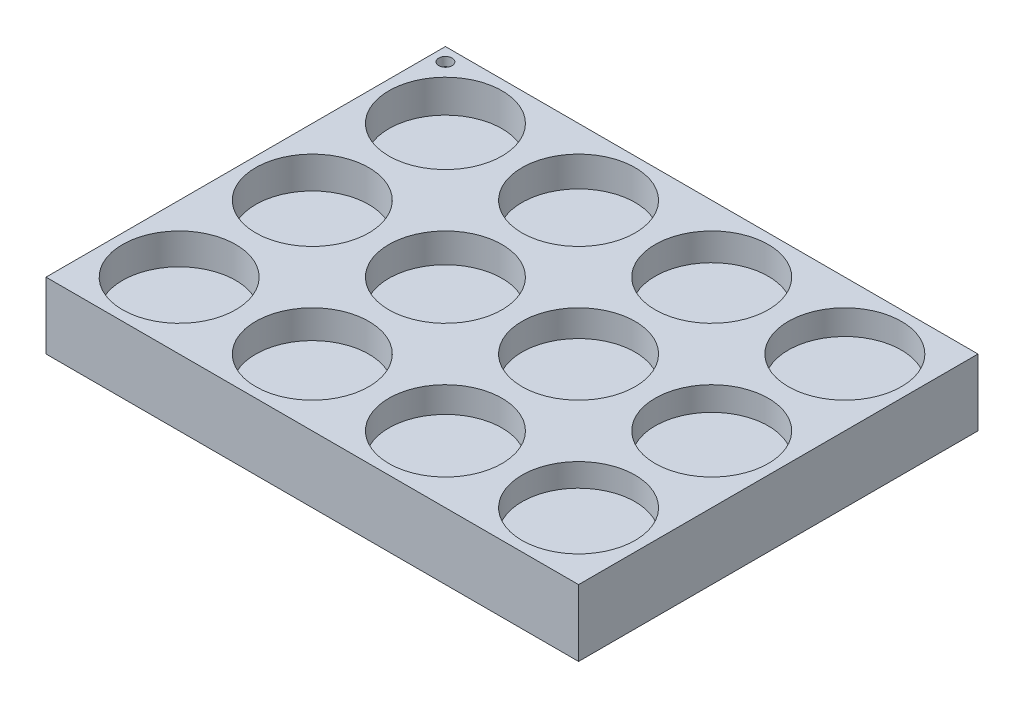
ISO-10303-21;
HEADER;
FILE_DESCRIPTION(('STEP AP214'),'2;1');
FILE_NAME('part.step','',(''),(''),'','','');
FILE_SCHEMA(('AUTOMOTIVE_DESIGN { 1 0 10303 214 1 1 1 1 }'));
ENDSEC;
DATA;
#1=APPLICATION_CONTEXT('core data for automotive mechanical design processes');
#2=APPLICATION_PROTOCOL_DEFINITION('international standard','automotive_design',2000,#1);
#3=PRODUCT_CONTEXT('',#1,'mechanical');
#4=PRODUCT('Part','Part','',(#3));
#5=PRODUCT_RELATED_PRODUCT_CATEGORY('part','',(#4));
#6=PRODUCT_DEFINITION_FORMATION('','',#4);
#7=PRODUCT_DEFINITION_CONTEXT('part definition',#1,'design');
#8=PRODUCT_DEFINITION('design','',#6,#7);
#9=PRODUCT_DEFINITION_SHAPE('','',#8);
#10=(LENGTH_UNIT() NAMED_UNIT(*) SI_UNIT(.MILLI.,.METRE.));
#11=(NAMED_UNIT(*) PLANE_ANGLE_UNIT() SI_UNIT($,.RADIAN.));
#12=(NAMED_UNIT(*) SI_UNIT($,.STERADIAN.) SOLID_ANGLE_UNIT());
#13=UNCERTAINTY_MEASURE_WITH_UNIT(LENGTH_MEASURE(1.E-05),#10,'distance_accuracy_value','');
#14=(GEOMETRIC_REPRESENTATION_CONTEXT(3) GLOBAL_UNCERTAINTY_ASSIGNED_CONTEXT((#13)) GLOBAL_UNIT_ASSIGNED_CONTEXT((#10,
#11,#12)) REPRESENTATION_CONTEXT('',''));
#15=CARTESIAN_POINT('',(0.,0.,0.));
#16=DIRECTION('',(0.,0.,1.));
#17=DIRECTION('',(1.,0.,0.));
#18=AXIS2_PLACEMENT_3D('',#15,#16,#17);
#19=CARTESIAN_POINT('',(0.,0.,0.));
#20=DIRECTION('',(0.,1.,0.));
#21=DIRECTION('',(0.,0.,1.));
#22=AXIS2_PLACEMENT_3D('',#19,#20,#21);
#23=PLANE('',#22);
#24=DIRECTION('',(0.,0.,1.));
#25=VECTOR('',#24,1.);
#26=CARTESIAN_POINT('',(-60.,0.,45.));
#27=LINE('',#26,#25);
#28=CARTESIAN_POINT('',(-60.,0.,-45.));
#29=VERTEX_POINT('',#28);
#30=CARTESIAN_POINT('',(-60.,0.,45.));
#31=VERTEX_POINT('',#30);
#32=EDGE_CURVE('E87',#29,#31,#27,.T.);
#33=ORIENTED_EDGE('',*,*,#32,.F.);
#34=DIRECTION('',(-1.,0.,0.));
#35=VECTOR('',#34,1.);
#36=CARTESIAN_POINT('',(60.,0.,-45.));
#37=LINE('',#36,#35);
#38=CARTESIAN_POINT('',(60.,0.,-45.));
#39=VERTEX_POINT('',#38);
#40=EDGE_CURVE('E56',#39,#29,#37,.T.);
#41=ORIENTED_EDGE('',*,*,#40,.F.);
#42=DIRECTION('',(0.,0.,-1.));
#43=VECTOR('',#42,1.);
#44=CARTESIAN_POINT('',(60.,0.,45.));
#45=LINE('',#44,#43);
#46=CARTESIAN_POINT('',(60.,0.,45.));
#47=VERTEX_POINT('',#46);
#48=EDGE_CURVE('E64',#47,#39,#45,.T.);
#49=ORIENTED_EDGE('',*,*,#48,.F.);
#50=DIRECTION('',(1.,0.,0.));
#51=VECTOR('',#50,1.);
#52=CARTESIAN_POINT('',(60.,0.,45.));
#53=LINE('',#52,#51);
#54=EDGE_CURVE('E183',#31,#47,#53,.T.);
#55=ORIENTED_EDGE('',*,*,#54,.F.);
#56=EDGE_LOOP('',(#33,#41,#49,#55));
#57=FACE_BOUND('',#56,.T.);
#58=CARTESIAN_POINT('',(-45.,0.,-30.));
#59=DIRECTION('',(0.,1.,0.));
#60=DIRECTION('',(0.,0.,1.));
#61=AXIS2_PLACEMENT_3D('',#58,#59,#60);
#62=CIRCLE('',#61,5.);
#63=CARTESIAN_POINT('',(-45.,0.,-25.));
#64=VERTEX_POINT('',#63);
#65=EDGE_CURVE('E177',#64,#64,#62,.T.);
#66=ORIENTED_EDGE('',*,*,#65,.T.);
#67=EDGE_LOOP('',(#66));
#68=FACE_BOUND('',#67,.T.);
#69=CARTESIAN_POINT('',(-15.,0.,-30.));
#70=DIRECTION('',(0.,1.,0.));
#71=DIRECTION('',(0.,0.,1.));
#72=AXIS2_PLACEMENT_3D('',#69,#70,#71);
#73=CIRCLE('',#72,5.);
#74=CARTESIAN_POINT('',(-15.,0.,-25.));
#75=VERTEX_POINT('',#74);
#76=EDGE_CURVE('E172',#75,#75,#73,.T.);
#77=ORIENTED_EDGE('',*,*,#76,.T.);
#78=EDGE_LOOP('',(#77));
#79=FACE_BOUND('',#78,.T.);
#80=CARTESIAN_POINT('',(15.,0.,-30.));
#81=DIRECTION('',(0.,1.,0.));
#82=DIRECTION('',(0.,0.,1.));
#83=AXIS2_PLACEMENT_3D('',#80,#81,#82);
#84=CIRCLE('',#83,5.);
#85=CARTESIAN_POINT('',(15.,0.,-25.));
#86=VERTEX_POINT('',#85);
#87=EDGE_CURVE('E166',#86,#86,#84,.T.);
#88=ORIENTED_EDGE('',*,*,#87,.T.);
#89=EDGE_LOOP('',(#88));
#90=FACE_BOUND('',#89,.T.);
#91=CARTESIAN_POINT('',(45.,0.,-30.));
#92=DIRECTION('',(0.,1.,0.));
#93=DIRECTION('',(0.,0.,1.));
#94=AXIS2_PLACEMENT_3D('',#91,#92,#93);
#95=CIRCLE('',#94,5.);
#96=CARTESIAN_POINT('',(45.,0.,-25.));
#97=VERTEX_POINT('',#96);
#98=EDGE_CURVE('E160',#97,#97,#95,.T.);
#99=ORIENTED_EDGE('',*,*,#98,.T.);
#100=EDGE_LOOP('',(#99));
#101=FACE_BOUND('',#100,.T.);
#102=CARTESIAN_POINT('',(-45.,0.,0.));
#103=DIRECTION('',(0.,1.,0.));
#104=DIRECTION('',(0.,0.,1.));
#105=AXIS2_PLACEMENT_3D('',#102,#103,#104);
#106=CIRCLE('',#105,5.);
#107=CARTESIAN_POINT('',(-45.,0.,5.00000000000001));
#108=VERTEX_POINT('',#107);
#109=EDGE_CURVE('E154',#108,#108,#106,.T.);
#110=ORIENTED_EDGE('',*,*,#109,.T.);
#111=EDGE_LOOP('',(#110));
#112=FACE_BOUND('',#111,.T.);
#113=CARTESIAN_POINT('',(-15.,0.,0.));
#114=DIRECTION('',(0.,1.,0.));
#115=DIRECTION('',(0.,0.,1.));
#116=AXIS2_PLACEMENT_3D('',#113,#114,#115);
#117=CIRCLE('',#116,5.);
#118=CARTESIAN_POINT('',(-15.,0.,5.));
#119=VERTEX_POINT('',#118);
#120=EDGE_CURVE('E148',#119,#119,#117,.T.);
#121=ORIENTED_EDGE('',*,*,#120,.T.);
#122=EDGE_LOOP('',(#121));
#123=FACE_BOUND('',#122,.T.);
#124=CARTESIAN_POINT('',(15.,0.,0.));
#125=DIRECTION('',(0.,1.,0.));
#126=DIRECTION('',(0.,0.,1.));
#127=AXIS2_PLACEMENT_3D('',#124,#125,#126);
#128=CIRCLE('',#127,5.);
#129=CARTESIAN_POINT('',(15.,0.,4.99999999999999));
#130=VERTEX_POINT('',#129);
#131=EDGE_CURVE('E142',#130,#130,#128,.T.);
#132=ORIENTED_EDGE('',*,*,#131,.T.);
#133=EDGE_LOOP('',(#132));
#134=FACE_BOUND('',#133,.T.);
#135=CARTESIAN_POINT('',(45.,0.,0.));
#136=DIRECTION('',(0.,1.,0.));
#137=DIRECTION('',(0.,0.,1.));
#138=AXIS2_PLACEMENT_3D('',#135,#136,#137);
#139=CIRCLE('',#138,5.);
#140=CARTESIAN_POINT('',(45.,0.,5.00000000000001));
#141=VERTEX_POINT('',#140);
#142=EDGE_CURVE('E136',#141,#141,#139,.T.);
#143=ORIENTED_EDGE('',*,*,#142,.T.);
#144=EDGE_LOOP('',(#143));
#145=FACE_BOUND('',#144,.T.);
#146=CARTESIAN_POINT('',(-45.,0.,30.));
#147=DIRECTION('',(0.,1.,0.));
#148=DIRECTION('',(0.,0.,1.));
#149=AXIS2_PLACEMENT_3D('',#146,#147,#148);
#150=CIRCLE('',#149,5.);
#151=CARTESIAN_POINT('',(-45.,0.,35.));
#152=VERTEX_POINT('',#151);
#153=EDGE_CURVE('E130',#152,#152,#150,.T.);
#154=ORIENTED_EDGE('',*,*,#153,.T.);
#155=EDGE_LOOP('',(#154));
#156=FACE_BOUND('',#155,.T.);
#157=CARTESIAN_POINT('',(-15.,0.,30.));
#158=DIRECTION('',(0.,1.,0.));
#159=DIRECTION('',(0.,0.,1.));
#160=AXIS2_PLACEMENT_3D('',#157,#158,#159);
#161=CIRCLE('',#160,5.);
#162=CARTESIAN_POINT('',(-15.,0.,35.));
#163=VERTEX_POINT('',#162);
#164=EDGE_CURVE('E124',#163,#163,#161,.T.);
#165=ORIENTED_EDGE('',*,*,#164,.T.);
#166=EDGE_LOOP('',(#165));
#167=FACE_BOUND('',#166,.T.);
#168=CARTESIAN_POINT('',(15.,0.,30.));
#169=DIRECTION('',(0.,1.,0.));
#170=DIRECTION('',(0.,0.,1.));
#171=AXIS2_PLACEMENT_3D('',#168,#169,#170);
#172=CIRCLE('',#171,5.);
#173=CARTESIAN_POINT('',(15.,0.,35.));
#174=VERTEX_POINT('',#173);
#175=EDGE_CURVE('E117',#174,#174,#172,.T.);
#176=ORIENTED_EDGE('',*,*,#175,.T.);
#177=EDGE_LOOP('',(#176));
#178=FACE_BOUND('',#177,.T.);
#179=CARTESIAN_POINT('',(45.,0.,30.));
#180=DIRECTION('',(0.,1.,0.));
#181=DIRECTION('',(0.,0.,1.));
#182=AXIS2_PLACEMENT_3D('',#179,#180,#181);
#183=CIRCLE('',#182,5.);
#184=CARTESIAN_POINT('',(45.,0.,35.));
#185=VERTEX_POINT('',#184);
#186=EDGE_CURVE('E114',#185,#185,#183,.T.);
#187=ORIENTED_EDGE('',*,*,#186,.T.);
#188=EDGE_LOOP('',(#187));
#189=FACE_BOUND('',#188,.T.);
#190=ADVANCED_FACE('F41',(#57,#68,#79,#90,#101,#112,#123,#134,#145,#156,#167,#178,#189),#23,.F.);
#191=CARTESIAN_POINT('',(-60.,5.,45.));
#192=DIRECTION('',(1.,0.,0.));
#193=DIRECTION('',(0.,0.,-1.));
#194=AXIS2_PLACEMENT_3D('',#191,#192,#193);
#195=PLANE('',#194);
#196=ORIENTED_EDGE('',*,*,#32,.T.);
#197=DIRECTION('',(0.,-1.,0.));
#198=VECTOR('',#197,1.);
#199=CARTESIAN_POINT('',(-60.,5.,45.));
#200=LINE('',#199,#198);
#201=CARTESIAN_POINT('',(-60.,15.,45.));
#202=VERTEX_POINT('',#201);
#203=EDGE_CURVE('E12',#202,#31,#200,.T.);
#204=ORIENTED_EDGE('',*,*,#203,.F.);
#205=DIRECTION('',(0.,0.,1.));
#206=VECTOR('',#205,1.);
#207=CARTESIAN_POINT('',(-60.,15.,-45.));
#208=LINE('',#207,#206);
#209=CARTESIAN_POINT('',(-60.,15.,-45.));
#210=VERTEX_POINT('',#209);
#211=EDGE_CURVE('E85',#210,#202,#208,.T.);
#212=ORIENTED_EDGE('',*,*,#211,.F.);
#213=DIRECTION('',(0.,-1.,0.));
#214=VECTOR('',#213,1.);
#215=CARTESIAN_POINT('',(-60.,5.,-45.));
#216=LINE('',#215,#214);
#217=EDGE_CURVE('E187',#210,#29,#216,.T.);
#218=ORIENTED_EDGE('',*,*,#217,.T.);
#219=EDGE_LOOP('',(#196,#204,#212,#218));
#220=FACE_BOUND('',#219,.T.);
#221=ADVANCED_FACE('F43',(#220),#195,.F.);
#222=CARTESIAN_POINT('',(60.,5.,45.));
#223=DIRECTION('',(0.,0.,-1.));
#224=DIRECTION('',(-1.,0.,0.));
#225=AXIS2_PLACEMENT_3D('',#222,#223,#224);
#226=PLANE('',#225);
#227=ORIENTED_EDGE('',*,*,#54,.T.);
#228=DIRECTION('',(0.,-1.,0.));
#229=VECTOR('',#228,1.);
#230=CARTESIAN_POINT('',(60.,5.,45.));
#231=LINE('',#230,#229);
#232=CARTESIAN_POINT('',(60.,15.,45.));
#233=VERTEX_POINT('',#232);
#234=EDGE_CURVE('E49',#233,#47,#231,.T.);
#235=ORIENTED_EDGE('',*,*,#234,.F.);
#236=DIRECTION('',(1.,0.,0.));
#237=VECTOR('',#236,1.);
#238=CARTESIAN_POINT('',(-60.,15.,45.));
#239=LINE('',#238,#237);
#240=EDGE_CURVE('E90',#202,#233,#239,.T.);
#241=ORIENTED_EDGE('',*,*,#240,.F.);
#242=ORIENTED_EDGE('',*,*,#203,.T.);
#243=EDGE_LOOP('',(#227,#235,#241,#242));
#244=FACE_BOUND('',#243,.T.);
#245=ADVANCED_FACE('F91',(#244),#226,.F.);
#246=CARTESIAN_POINT('',(60.,5.,45.));
#247=DIRECTION('',(-1.,0.,0.));
#248=DIRECTION('',(0.,0.,1.));
#249=AXIS2_PLACEMENT_3D('',#246,#247,#248);
#250=PLANE('',#249);
#251=ORIENTED_EDGE('',*,*,#48,.T.);
#252=DIRECTION('',(0.,-1.,0.));
#253=VECTOR('',#252,1.);
#254=CARTESIAN_POINT('',(60.,5.,-45.));
#255=LINE('',#254,#253);
#256=CARTESIAN_POINT('',(60.,15.,-45.));
#257=VERTEX_POINT('',#256);
#258=EDGE_CURVE('E189',#257,#39,#255,.T.);
#259=ORIENTED_EDGE('',*,*,#258,.F.);
#260=DIRECTION('',(0.,0.,-1.));
#261=VECTOR('',#260,1.);
#262=CARTESIAN_POINT('',(60.,15.,-45.));
#263=LINE('',#262,#261);
#264=EDGE_CURVE('E95',#233,#257,#263,.T.);
#265=ORIENTED_EDGE('',*,*,#264,.F.);
#266=ORIENTED_EDGE('',*,*,#234,.T.);
#267=EDGE_LOOP('',(#251,#259,#265,#266));
#268=FACE_BOUND('',#267,.T.);
#269=ADVANCED_FACE('F190',(#268),#250,.F.);
#270=CARTESIAN_POINT('',(60.,5.,-45.));
#271=DIRECTION('',(0.,0.,1.));
#272=DIRECTION('',(1.,0.,0.));
#273=AXIS2_PLACEMENT_3D('',#270,#271,#272);
#274=PLANE('',#273);
#275=ORIENTED_EDGE('',*,*,#40,.T.);
#276=ORIENTED_EDGE('',*,*,#217,.F.);
#277=DIRECTION('',(-1.,0.,0.));
#278=VECTOR('',#277,1.);
#279=CARTESIAN_POINT('',(-60.,15.,-45.));
#280=LINE('',#279,#278);
#281=EDGE_CURVE('E100',#257,#210,#280,.T.);
#282=ORIENTED_EDGE('',*,*,#281,.F.);
#283=ORIENTED_EDGE('',*,*,#258,.T.);
#284=EDGE_LOOP('',(#275,#276,#282,#283));
#285=FACE_BOUND('',#284,.T.);
#286=ADVANCED_FACE('F275',(#285),#274,.F.);
#287=CARTESIAN_POINT('',(-45.,5.,-30.));
#288=DIRECTION('',(0.,-1.,0.));
#289=DIRECTION('',(0.,0.,-1.));
#290=AXIS2_PLACEMENT_3D('',#287,#288,#289);
#291=CYLINDRICAL_SURFACE('',#290,5.);
#292=CARTESIAN_POINT('',(-45.,5.,-30.));
#293=DIRECTION('',(0.,1.,0.));
#294=DIRECTION('',(0.,0.,1.));
#295=AXIS2_PLACEMENT_3D('',#292,#293,#294);
#296=CIRCLE('',#295,5.);
#297=CARTESIAN_POINT('',(-45.,5.,-25.));
#298=VERTEX_POINT('',#297);
#299=EDGE_CURVE('E169',#298,#298,#296,.T.);
#300=ORIENTED_EDGE('',*,*,#299,.T.);
#301=EDGE_LOOP('',(#300));
#302=FACE_BOUND('',#301,.T.);
#303=ORIENTED_EDGE('',*,*,#65,.F.);
#304=EDGE_LOOP('',(#303));
#305=FACE_BOUND('',#304,.T.);
#306=ADVANCED_FACE('F272',(#302,#305),#291,.F.);
#307=CARTESIAN_POINT('',(-15.,5.,-30.));
#308=DIRECTION('',(0.,-1.,0.));
#309=DIRECTION('',(0.,0.,-1.));
#310=AXIS2_PLACEMENT_3D('',#307,#308,#309);
#311=CYLINDRICAL_SURFACE('',#310,5.);
#312=CARTESIAN_POINT('',(-15.,5.,-30.));
#313=DIRECTION('',(0.,1.,0.));
#314=DIRECTION('',(0.,0.,1.));
#315=AXIS2_PLACEMENT_3D('',#312,#313,#314);
#316=CIRCLE('',#315,5.);
#317=CARTESIAN_POINT('',(-15.,5.,-25.));
#318=VERTEX_POINT('',#317);
#319=EDGE_CURVE('E163',#318,#318,#316,.T.);
#320=ORIENTED_EDGE('',*,*,#319,.T.);
#321=EDGE_LOOP('',(#320));
#322=FACE_BOUND('',#321,.T.);
#323=ORIENTED_EDGE('',*,*,#76,.F.);
#324=EDGE_LOOP('',(#323));
#325=FACE_BOUND('',#324,.T.);
#326=ADVANCED_FACE('F268',(#322,#325),#311,.F.);
#327=CARTESIAN_POINT('',(15.,5.,-30.));
#328=DIRECTION('',(0.,-1.,0.));
#329=DIRECTION('',(0.,0.,-1.));
#330=AXIS2_PLACEMENT_3D('',#327,#328,#329);
#331=CYLINDRICAL_SURFACE('',#330,5.);
#332=CARTESIAN_POINT('',(15.,5.,-30.));
#333=DIRECTION('',(0.,1.,0.));
#334=DIRECTION('',(0.,0.,1.));
#335=AXIS2_PLACEMENT_3D('',#332,#333,#334);
#336=CIRCLE('',#335,5.);
#337=CARTESIAN_POINT('',(15.,5.,-25.));
#338=VERTEX_POINT('',#337);
#339=EDGE_CURVE('E157',#338,#338,#336,.T.);
#340=ORIENTED_EDGE('',*,*,#339,.T.);
#341=EDGE_LOOP('',(#340));
#342=FACE_BOUND('',#341,.T.);
#343=ORIENTED_EDGE('',*,*,#87,.F.);
#344=EDGE_LOOP('',(#343));
#345=FACE_BOUND('',#344,.T.);
#346=ADVANCED_FACE('F264',(#342,#345),#331,.F.);
#347=CARTESIAN_POINT('',(45.,5.,-30.));
#348=DIRECTION('',(0.,-1.,0.));
#349=DIRECTION('',(0.,0.,-1.));
#350=AXIS2_PLACEMENT_3D('',#347,#348,#349);
#351=CYLINDRICAL_SURFACE('',#350,5.);
#352=CARTESIAN_POINT('',(45.,5.,-30.));
#353=DIRECTION('',(0.,1.,0.));
#354=DIRECTION('',(0.,0.,1.));
#355=AXIS2_PLACEMENT_3D('',#352,#353,#354);
#356=CIRCLE('',#355,5.);
#357=CARTESIAN_POINT('',(45.,5.,-25.));
#358=VERTEX_POINT('',#357);
#359=EDGE_CURVE('E151',#358,#358,#356,.T.);
#360=ORIENTED_EDGE('',*,*,#359,.T.);
#361=EDGE_LOOP('',(#360));
#362=FACE_BOUND('',#361,.T.);
#363=ORIENTED_EDGE('',*,*,#98,.F.);
#364=EDGE_LOOP('',(#363));
#365=FACE_BOUND('',#364,.T.);
#366=ADVANCED_FACE('F260',(#362,#365),#351,.F.);
#367=CARTESIAN_POINT('',(-45.,5.,0.));
#368=DIRECTION('',(0.,-1.,0.));
#369=DIRECTION('',(0.,0.,-1.));
#370=AXIS2_PLACEMENT_3D('',#367,#368,#369);
#371=CYLINDRICAL_SURFACE('',#370,5.);
#372=CARTESIAN_POINT('',(-45.,5.,0.));
#373=DIRECTION('',(0.,1.,0.));
#374=DIRECTION('',(0.,0.,1.));
#375=AXIS2_PLACEMENT_3D('',#372,#373,#374);
#376=CIRCLE('',#375,5.);
#377=CARTESIAN_POINT('',(-45.,5.,5.00000000000001));
#378=VERTEX_POINT('',#377);
#379=EDGE_CURVE('E145',#378,#378,#376,.T.);
#380=ORIENTED_EDGE('',*,*,#379,.T.);
#381=EDGE_LOOP('',(#380));
#382=FACE_BOUND('',#381,.T.);
#383=ORIENTED_EDGE('',*,*,#109,.F.);
#384=EDGE_LOOP('',(#383));
#385=FACE_BOUND('',#384,.T.);
#386=ADVANCED_FACE('F256',(#382,#385),#371,.F.);
#387=CARTESIAN_POINT('',(-15.,5.,0.));
#388=DIRECTION('',(0.,-1.,0.));
#389=DIRECTION('',(0.,0.,-1.));
#390=AXIS2_PLACEMENT_3D('',#387,#388,#389);
#391=CYLINDRICAL_SURFACE('',#390,5.);
#392=CARTESIAN_POINT('',(-15.,5.,0.));
#393=DIRECTION('',(0.,1.,0.));
#394=DIRECTION('',(0.,0.,1.));
#395=AXIS2_PLACEMENT_3D('',#392,#393,#394);
#396=CIRCLE('',#395,5.);
#397=CARTESIAN_POINT('',(-15.,5.,5.));
#398=VERTEX_POINT('',#397);
#399=EDGE_CURVE('E139',#398,#398,#396,.T.);
#400=ORIENTED_EDGE('',*,*,#399,.T.);
#401=EDGE_LOOP('',(#400));
#402=FACE_BOUND('',#401,.T.);
#403=ORIENTED_EDGE('',*,*,#120,.F.);
#404=EDGE_LOOP('',(#403));
#405=FACE_BOUND('',#404,.T.);
#406=ADVANCED_FACE('F252',(#402,#405),#391,.F.);
#407=CARTESIAN_POINT('',(15.,5.,0.));
#408=DIRECTION('',(0.,-1.,0.));
#409=DIRECTION('',(0.,0.,-1.));
#410=AXIS2_PLACEMENT_3D('',#407,#408,#409);
#411=CYLINDRICAL_SURFACE('',#410,5.);
#412=CARTESIAN_POINT('',(15.,5.,0.));
#413=DIRECTION('',(0.,1.,0.));
#414=DIRECTION('',(0.,0.,1.));
#415=AXIS2_PLACEMENT_3D('',#412,#413,#414);
#416=CIRCLE('',#415,5.);
#417=CARTESIAN_POINT('',(15.,5.,4.99999999999999));
#418=VERTEX_POINT('',#417);
#419=EDGE_CURVE('E133',#418,#418,#416,.T.);
#420=ORIENTED_EDGE('',*,*,#419,.T.);
#421=EDGE_LOOP('',(#420));
#422=FACE_BOUND('',#421,.T.);
#423=ORIENTED_EDGE('',*,*,#131,.F.);
#424=EDGE_LOOP('',(#423));
#425=FACE_BOUND('',#424,.T.);
#426=ADVANCED_FACE('F248',(#422,#425),#411,.F.);
#427=CARTESIAN_POINT('',(45.,5.,0.));
#428=DIRECTION('',(0.,-1.,0.));
#429=DIRECTION('',(0.,0.,-1.));
#430=AXIS2_PLACEMENT_3D('',#427,#428,#429);
#431=CYLINDRICAL_SURFACE('',#430,5.);
#432=CARTESIAN_POINT('',(45.,5.,0.));
#433=DIRECTION('',(0.,1.,0.));
#434=DIRECTION('',(0.,0.,1.));
#435=AXIS2_PLACEMENT_3D('',#432,#433,#434);
#436=CIRCLE('',#435,5.);
#437=CARTESIAN_POINT('',(45.,5.,5.00000000000001));
#438=VERTEX_POINT('',#437);
#439=EDGE_CURVE('E127',#438,#438,#436,.T.);
#440=ORIENTED_EDGE('',*,*,#439,.T.);
#441=EDGE_LOOP('',(#440));
#442=FACE_BOUND('',#441,.T.);
#443=ORIENTED_EDGE('',*,*,#142,.F.);
#444=EDGE_LOOP('',(#443));
#445=FACE_BOUND('',#444,.T.);
#446=ADVANCED_FACE('F244',(#442,#445),#431,.F.);
#447=CARTESIAN_POINT('',(-45.,5.,30.));
#448=DIRECTION('',(0.,-1.,0.));
#449=DIRECTION('',(0.,0.,-1.));
#450=AXIS2_PLACEMENT_3D('',#447,#448,#449);
#451=CYLINDRICAL_SURFACE('',#450,5.);
#452=CARTESIAN_POINT('',(-45.,5.,30.));
#453=DIRECTION('',(0.,1.,0.));
#454=DIRECTION('',(0.,0.,1.));
#455=AXIS2_PLACEMENT_3D('',#452,#453,#454);
#456=CIRCLE('',#455,5.);
#457=CARTESIAN_POINT('',(-45.,5.,35.));
#458=VERTEX_POINT('',#457);
#459=EDGE_CURVE('E121',#458,#458,#456,.T.);
#460=ORIENTED_EDGE('',*,*,#459,.T.);
#461=EDGE_LOOP('',(#460));
#462=FACE_BOUND('',#461,.T.);
#463=ORIENTED_EDGE('',*,*,#153,.F.);
#464=EDGE_LOOP('',(#463));
#465=FACE_BOUND('',#464,.T.);
#466=ADVANCED_FACE('F240',(#462,#465),#451,.F.);
#467=CARTESIAN_POINT('',(-15.,5.,30.));
#468=DIRECTION('',(0.,-1.,0.));
#469=DIRECTION('',(0.,0.,-1.));
#470=AXIS2_PLACEMENT_3D('',#467,#468,#469);
#471=CYLINDRICAL_SURFACE('',#470,5.);
#472=CARTESIAN_POINT('',(-15.,5.,30.));
#473=DIRECTION('',(0.,1.,0.));
#474=DIRECTION('',(0.,0.,1.));
#475=AXIS2_PLACEMENT_3D('',#472,#473,#474);
#476=CIRCLE('',#475,5.);
#477=CARTESIAN_POINT('',(-15.,5.,35.));
#478=VERTEX_POINT('',#477);
#479=EDGE_CURVE('E113',#478,#478,#476,.T.);
#480=ORIENTED_EDGE('',*,*,#479,.T.);
#481=EDGE_LOOP('',(#480));
#482=FACE_BOUND('',#481,.T.);
#483=ORIENTED_EDGE('',*,*,#164,.F.);
#484=EDGE_LOOP('',(#483));
#485=FACE_BOUND('',#484,.T.);
#486=ADVANCED_FACE('F233',(#482,#485),#471,.F.);
#487=CARTESIAN_POINT('',(15.,5.,30.));
#488=DIRECTION('',(0.,-1.,0.));
#489=DIRECTION('',(0.,0.,-1.));
#490=AXIS2_PLACEMENT_3D('',#487,#488,#489);
#491=CYLINDRICAL_SURFACE('',#490,5.);
#492=CARTESIAN_POINT('',(15.,5.,30.));
#493=DIRECTION('',(0.,1.,0.));
#494=DIRECTION('',(0.,0.,1.));
#495=AXIS2_PLACEMENT_3D('',#492,#493,#494);
#496=CIRCLE('',#495,5.);
#497=CARTESIAN_POINT('',(15.,5.,35.));
#498=VERTEX_POINT('',#497);
#499=EDGE_CURVE('E118',#498,#498,#496,.T.);
#500=ORIENTED_EDGE('',*,*,#499,.T.);
#501=EDGE_LOOP('',(#500));
#502=FACE_BOUND('',#501,.T.);
#503=ORIENTED_EDGE('',*,*,#175,.F.);
#504=EDGE_LOOP('',(#503));
#505=FACE_BOUND('',#504,.T.);
#506=ADVANCED_FACE('F222',(#502,#505),#491,.F.);
#507=CARTESIAN_POINT('',(45.,5.,30.));
#508=DIRECTION('',(0.,-1.,0.));
#509=DIRECTION('',(0.,0.,-1.));
#510=AXIS2_PLACEMENT_3D('',#507,#508,#509);
#511=CYLINDRICAL_SURFACE('',#510,5.);
#512=CARTESIAN_POINT('',(45.,5.,30.));
#513=DIRECTION('',(0.,1.,0.));
#514=DIRECTION('',(0.,0.,1.));
#515=AXIS2_PLACEMENT_3D('',#512,#513,#514);
#516=CIRCLE('',#515,5.);
#517=CARTESIAN_POINT('',(45.,5.,35.));
#518=VERTEX_POINT('',#517);
#519=EDGE_CURVE('E110',#518,#518,#516,.T.);
#520=ORIENTED_EDGE('',*,*,#519,.T.);
#521=EDGE_LOOP('',(#520));
#522=FACE_BOUND('',#521,.T.);
#523=ORIENTED_EDGE('',*,*,#186,.F.);
#524=EDGE_LOOP('',(#523));
#525=FACE_BOUND('',#524,.T.);
#526=ADVANCED_FACE('F219',(#522,#525),#511,.F.);
#527=CARTESIAN_POINT('',(0.,5.,0.));
#528=DIRECTION('',(0.,1.,0.));
#529=DIRECTION('',(0.,0.,1.));
#530=AXIS2_PLACEMENT_3D('',#527,#528,#529);
#531=PLANE('',#530);
#532=ORIENTED_EDGE('',*,*,#519,.F.);
#533=EDGE_LOOP('',(#532));
#534=FACE_BOUND('',#533,.T.);
#535=ADVANCED_FACE('F221',(#534),#531,.F.);
#536=ORIENTED_EDGE('',*,*,#479,.F.);
#537=EDGE_LOOP('',(#536));
#538=FACE_BOUND('',#537,.T.);
#539=ADVANCED_FACE('F229',(#538),#531,.F.);
#540=ORIENTED_EDGE('',*,*,#439,.F.);
#541=EDGE_LOOP('',(#540));
#542=FACE_BOUND('',#541,.T.);
#543=ADVANCED_FACE('F425',(#542),#531,.F.);
#544=ORIENTED_EDGE('',*,*,#399,.F.);
#545=EDGE_LOOP('',(#544));
#546=FACE_BOUND('',#545,.T.);
#547=ADVANCED_FACE('F435',(#546),#531,.F.);
#548=ORIENTED_EDGE('',*,*,#359,.F.);
#549=EDGE_LOOP('',(#548));
#550=FACE_BOUND('',#549,.T.);
#551=ADVANCED_FACE('F445',(#550),#531,.F.);
#552=ORIENTED_EDGE('',*,*,#319,.F.);
#553=EDGE_LOOP('',(#552));
#554=FACE_BOUND('',#553,.T.);
#555=ADVANCED_FACE('F455',(#554),#531,.F.);
#556=ORIENTED_EDGE('',*,*,#299,.F.);
#557=EDGE_LOOP('',(#556));
#558=FACE_BOUND('',#557,.T.);
#559=ADVANCED_FACE('F465',(#558),#531,.F.);
#560=ORIENTED_EDGE('',*,*,#339,.F.);
#561=EDGE_LOOP('',(#560));
#562=FACE_BOUND('',#561,.T.);
#563=ADVANCED_FACE('F475',(#562),#531,.F.);
#564=ORIENTED_EDGE('',*,*,#379,.F.);
#565=EDGE_LOOP('',(#564));
#566=FACE_BOUND('',#565,.T.);
#567=ADVANCED_FACE('F485',(#566),#531,.F.);
#568=ORIENTED_EDGE('',*,*,#419,.F.);
#569=EDGE_LOOP('',(#568));
#570=FACE_BOUND('',#569,.T.);
#571=ADVANCED_FACE('F495',(#570),#531,.F.);
#572=ORIENTED_EDGE('',*,*,#459,.F.);
#573=EDGE_LOOP('',(#572));
#574=FACE_BOUND('',#573,.T.);
#575=ADVANCED_FACE('F505',(#574),#531,.F.);
#576=ORIENTED_EDGE('',*,*,#499,.F.);
#577=EDGE_LOOP('',(#576));
#578=FACE_BOUND('',#577,.T.);
#579=ADVANCED_FACE('F232',(#578),#531,.F.);
#580=CARTESIAN_POINT('',(0.,15.,0.));
#581=DIRECTION('',(0.,1.,0.));
#582=DIRECTION('',(0.,0.,1.));
#583=AXIS2_PLACEMENT_3D('',#580,#581,#582);
#584=PLANE('',#583);
#585=CARTESIAN_POINT('',(-57.0078057300643,15.,-42.0078057300642));
#586=DIRECTION('',(0.,1.,0.));
#587=DIRECTION('',(0.,0.,1.));
#588=AXIS2_PLACEMENT_3D('',#585,#586,#587);
#589=CIRCLE('',#588,1.5);
#590=CARTESIAN_POINT('',(-57.0078057300643,15.,-40.5078057300642));
#591=VERTEX_POINT('',#590);
#592=EDGE_CURVE('E864',#591,#591,#589,.T.);
#593=ORIENTED_EDGE('',*,*,#592,.F.);
#594=EDGE_LOOP('',(#593));
#595=FACE_BOUND('',#594,.T.);
#596=CARTESIAN_POINT('',(45.,15.,30.));
#597=DIRECTION('',(0.,1.,0.));
#598=DIRECTION('',(0.,0.,1.));
#599=AXIS2_PLACEMENT_3D('',#596,#597,#598);
#600=CIRCLE('',#599,12.75);
#601=CARTESIAN_POINT('',(45.,15.,42.75));
#602=VERTEX_POINT('',#601);
#603=EDGE_CURVE('E863',#602,#602,#600,.T.);
#604=ORIENTED_EDGE('',*,*,#603,.F.);
#605=EDGE_LOOP('',(#604));
#606=FACE_BOUND('',#605,.T.);
#607=CARTESIAN_POINT('',(45.,15.,0.));
#608=DIRECTION('',(0.,1.,0.));
#609=DIRECTION('',(0.,0.,1.));
#610=AXIS2_PLACEMENT_3D('',#607,#608,#609);
#611=CIRCLE('',#610,12.75);
#612=CARTESIAN_POINT('',(45.,15.,12.75));
#613=VERTEX_POINT('',#612);
#614=EDGE_CURVE('E874',#613,#613,#611,.T.);
#615=ORIENTED_EDGE('',*,*,#614,.F.);
#616=EDGE_LOOP('',(#615));
#617=FACE_BOUND('',#616,.T.);
#618=CARTESIAN_POINT('',(45.,15.,-30.));
#619=DIRECTION('',(0.,1.,0.));
#620=DIRECTION('',(0.,0.,1.));
#621=AXIS2_PLACEMENT_3D('',#618,#619,#620);
#622=CIRCLE('',#621,12.75);
#623=CARTESIAN_POINT('',(45.,15.,-17.25));
#624=VERTEX_POINT('',#623);
#625=EDGE_CURVE('E880',#624,#624,#622,.T.);
#626=ORIENTED_EDGE('',*,*,#625,.F.);
#627=EDGE_LOOP('',(#626));
#628=FACE_BOUND('',#627,.T.);
#629=CARTESIAN_POINT('',(15.,15.,30.));
#630=DIRECTION('',(0.,1.,0.));
#631=DIRECTION('',(0.,0.,1.));
#632=AXIS2_PLACEMENT_3D('',#629,#630,#631);
#633=CIRCLE('',#632,12.75);
#634=CARTESIAN_POINT('',(15.,15.,42.75));
#635=VERTEX_POINT('',#634);
#636=EDGE_CURVE('E886',#635,#635,#633,.T.);
#637=ORIENTED_EDGE('',*,*,#636,.F.);
#638=EDGE_LOOP('',(#637));
#639=FACE_BOUND('',#638,.T.);
#640=CARTESIAN_POINT('',(15.,15.,0.));
#641=DIRECTION('',(0.,1.,0.));
#642=DIRECTION('',(0.,0.,1.));
#643=AXIS2_PLACEMENT_3D('',#640,#641,#642);
#644=CIRCLE('',#643,12.75);
#645=CARTESIAN_POINT('',(15.,15.,12.75));
#646=VERTEX_POINT('',#645);
#647=EDGE_CURVE('E892',#646,#646,#644,.T.);
#648=ORIENTED_EDGE('',*,*,#647,.F.);
#649=EDGE_LOOP('',(#648));
#650=FACE_BOUND('',#649,.T.);
#651=CARTESIAN_POINT('',(15.,15.,-30.));
#652=DIRECTION('',(0.,1.,0.));
#653=DIRECTION('',(0.,0.,1.));
#654=AXIS2_PLACEMENT_3D('',#651,#652,#653);
#655=CIRCLE('',#654,12.75);
#656=CARTESIAN_POINT('',(15.,15.,-17.25));
#657=VERTEX_POINT('',#656);
#658=EDGE_CURVE('E898',#657,#657,#655,.T.);
#659=ORIENTED_EDGE('',*,*,#658,.F.);
#660=EDGE_LOOP('',(#659));
#661=FACE_BOUND('',#660,.T.);
#662=CARTESIAN_POINT('',(-15.,15.,30.));
#663=DIRECTION('',(0.,1.,0.));
#664=DIRECTION('',(0.,0.,1.));
#665=AXIS2_PLACEMENT_3D('',#662,#663,#664);
#666=CIRCLE('',#665,12.75);
#667=CARTESIAN_POINT('',(-15.,15.,42.75));
#668=VERTEX_POINT('',#667);
#669=EDGE_CURVE('E904',#668,#668,#666,.T.);
#670=ORIENTED_EDGE('',*,*,#669,.F.);
#671=EDGE_LOOP('',(#670));
#672=FACE_BOUND('',#671,.T.);
#673=CARTESIAN_POINT('',(-15.,15.,0.));
#674=DIRECTION('',(0.,1.,0.));
#675=DIRECTION('',(0.,0.,1.));
#676=AXIS2_PLACEMENT_3D('',#673,#674,#675);
#677=CIRCLE('',#676,12.75);
#678=CARTESIAN_POINT('',(-15.,15.,12.75));
#679=VERTEX_POINT('',#678);
#680=EDGE_CURVE('E910',#679,#679,#677,.T.);
#681=ORIENTED_EDGE('',*,*,#680,.F.);
#682=EDGE_LOOP('',(#681));
#683=FACE_BOUND('',#682,.T.);
#684=CARTESIAN_POINT('',(-15.,15.,-30.));
#685=DIRECTION('',(0.,1.,0.));
#686=DIRECTION('',(0.,0.,1.));
#687=AXIS2_PLACEMENT_3D('',#684,#685,#686);
#688=CIRCLE('',#687,12.75);
#689=CARTESIAN_POINT('',(-15.,15.,-17.25));
#690=VERTEX_POINT('',#689);
#691=EDGE_CURVE('E916',#690,#690,#688,.T.);
#692=ORIENTED_EDGE('',*,*,#691,.F.);
#693=EDGE_LOOP('',(#692));
#694=FACE_BOUND('',#693,.T.);
#695=CARTESIAN_POINT('',(-45.,15.,30.));
#696=DIRECTION('',(0.,1.,0.));
#697=DIRECTION('',(0.,0.,1.));
#698=AXIS2_PLACEMENT_3D('',#695,#696,#697);
#699=CIRCLE('',#698,12.75);
#700=CARTESIAN_POINT('',(-45.,15.,42.75));
#701=VERTEX_POINT('',#700);
#702=EDGE_CURVE('E922',#701,#701,#699,.T.);
#703=ORIENTED_EDGE('',*,*,#702,.F.);
#704=EDGE_LOOP('',(#703));
#705=FACE_BOUND('',#704,.T.);
#706=CARTESIAN_POINT('',(-45.,15.,0.));
#707=DIRECTION('',(0.,1.,0.));
#708=DIRECTION('',(0.,0.,1.));
#709=AXIS2_PLACEMENT_3D('',#706,#707,#708);
#710=CIRCLE('',#709,12.75);
#711=CARTESIAN_POINT('',(-45.,15.,12.75));
#712=VERTEX_POINT('',#711);
#713=EDGE_CURVE('E928',#712,#712,#710,.T.);
#714=ORIENTED_EDGE('',*,*,#713,.F.);
#715=EDGE_LOOP('',(#714));
#716=FACE_BOUND('',#715,.T.);
#717=CARTESIAN_POINT('',(-45.,15.,-30.));
#718=DIRECTION('',(0.,1.,0.));
#719=DIRECTION('',(0.,0.,1.));
#720=AXIS2_PLACEMENT_3D('',#717,#718,#719);
#721=CIRCLE('',#720,12.75);
#722=CARTESIAN_POINT('',(-45.,15.,-17.25));
#723=VERTEX_POINT('',#722);
#724=EDGE_CURVE('E104',#723,#723,#721,.T.);
#725=ORIENTED_EDGE('',*,*,#724,.F.);
#726=EDGE_LOOP('',(#725));
#727=FACE_BOUND('',#726,.T.);
#728=ORIENTED_EDGE('',*,*,#211,.T.);
#729=ORIENTED_EDGE('',*,*,#240,.T.);
#730=ORIENTED_EDGE('',*,*,#264,.T.);
#731=ORIENTED_EDGE('',*,*,#281,.T.);
#732=EDGE_LOOP('',(#728,#729,#730,#731));
#733=FACE_BOUND('',#732,.T.);
#734=ADVANCED_FACE('F98',(#595,#606,#617,#628,#639,#650,#661,#672,#683,#694,#705,#716,#727,
#733),#584,.T.);
#735=CARTESIAN_POINT('',(-45.,-31.0624458405139,-30.));
#736=DIRECTION('',(0.,1.,0.));
#737=DIRECTION('',(0.,0.,1.));
#738=AXIS2_PLACEMENT_3D('',#735,#736,#737);
#739=CYLINDRICAL_SURFACE('',#738,12.75);
#740=CARTESIAN_POINT('',(-45.,7.6,-30.));
#741=DIRECTION('',(0.,1.,0.));
#742=DIRECTION('',(0.,0.,1.));
#743=AXIS2_PLACEMENT_3D('',#740,#741,#742);
#744=CIRCLE('',#743,12.75);
#745=CARTESIAN_POINT('',(-45.,7.6,-17.25));
#746=VERTEX_POINT('',#745);
#747=EDGE_CURVE('E101',#746,#746,#744,.F.);
#748=ORIENTED_EDGE('',*,*,#747,.T.);
#749=EDGE_LOOP('',(#748));
#750=FACE_BOUND('',#749,.T.);
#751=ORIENTED_EDGE('',*,*,#724,.T.);
#752=EDGE_LOOP('',(#751));
#753=FACE_BOUND('',#752,.T.);
#754=ADVANCED_FACE('F534',(#750,#753),#739,.F.);
#755=CARTESIAN_POINT('',(0.,7.6,0.));
#756=DIRECTION('',(0.,1.,0.));
#757=DIRECTION('',(0.,0.,1.));
#758=AXIS2_PLACEMENT_3D('',#755,#756,#757);
#759=PLANE('',#758);
#760=ORIENTED_EDGE('',*,*,#747,.F.);
#761=EDGE_LOOP('',(#760));
#762=FACE_BOUND('',#761,.T.);
#763=ADVANCED_FACE('F545',(#762),#759,.T.);
#764=CARTESIAN_POINT('',(-45.,-31.0624458405139,0.));
#765=DIRECTION('',(0.,1.,0.));
#766=DIRECTION('',(0.,0.,1.));
#767=AXIS2_PLACEMENT_3D('',#764,#765,#766);
#768=CYLINDRICAL_SURFACE('',#767,12.75);
#769=CARTESIAN_POINT('',(-45.,7.8,0.));
#770=DIRECTION('',(0.,1.,0.));
#771=DIRECTION('',(0.,0.,1.));
#772=AXIS2_PLACEMENT_3D('',#769,#770,#771);
#773=CIRCLE('',#772,12.75);
#774=CARTESIAN_POINT('',(-45.,7.8,12.75));
#775=VERTEX_POINT('',#774);
#776=EDGE_CURVE('E931',#775,#775,#773,.F.);
#777=ORIENTED_EDGE('',*,*,#776,.T.);
#778=EDGE_LOOP('',(#777));
#779=FACE_BOUND('',#778,.T.);
#780=ORIENTED_EDGE('',*,*,#713,.T.);
#781=EDGE_LOOP('',(#780));
#782=FACE_BOUND('',#781,.T.);
#783=ADVANCED_FACE('F556',(#779,#782),#768,.F.);
#784=CARTESIAN_POINT('',(0.,7.8,0.));
#785=DIRECTION('',(0.,1.,0.));
#786=DIRECTION('',(0.,0.,1.));
#787=AXIS2_PLACEMENT_3D('',#784,#785,#786);
#788=PLANE('',#787);
#789=ORIENTED_EDGE('',*,*,#776,.F.);
#790=EDGE_LOOP('',(#789));
#791=FACE_BOUND('',#790,.T.);
#792=ADVANCED_FACE('F567',(#791),#788,.T.);
#793=CARTESIAN_POINT('',(-45.,-31.0624458405139,30.));
#794=DIRECTION('',(0.,1.,0.));
#795=DIRECTION('',(0.,0.,1.));
#796=AXIS2_PLACEMENT_3D('',#793,#794,#795);
#797=CYLINDRICAL_SURFACE('',#796,12.75);
#798=CARTESIAN_POINT('',(-45.,8.,30.));
#799=DIRECTION('',(0.,1.,0.));
#800=DIRECTION('',(0.,0.,1.));
#801=AXIS2_PLACEMENT_3D('',#798,#799,#800);
#802=CIRCLE('',#801,12.75);
#803=CARTESIAN_POINT('',(-45.,8.,42.75));
#804=VERTEX_POINT('',#803);
#805=EDGE_CURVE('E925',#804,#804,#802,.F.);
#806=ORIENTED_EDGE('',*,*,#805,.T.);
#807=EDGE_LOOP('',(#806));
#808=FACE_BOUND('',#807,.T.);
#809=ORIENTED_EDGE('',*,*,#702,.T.);
#810=EDGE_LOOP('',(#809));
#811=FACE_BOUND('',#810,.T.);
#812=ADVANCED_FACE('F578',(#808,#811),#797,.F.);
#813=CARTESIAN_POINT('',(0.,8.,0.));
#814=DIRECTION('',(0.,1.,0.));
#815=DIRECTION('',(0.,0.,1.));
#816=AXIS2_PLACEMENT_3D('',#813,#814,#815);
#817=PLANE('',#816);
#818=ORIENTED_EDGE('',*,*,#805,.F.);
#819=EDGE_LOOP('',(#818));
#820=FACE_BOUND('',#819,.T.);
#821=ADVANCED_FACE('F589',(#820),#817,.T.);
#822=CARTESIAN_POINT('',(-15.,-31.0624458405139,-30.));
#823=DIRECTION('',(0.,1.,0.));
#824=DIRECTION('',(0.,0.,1.));
#825=AXIS2_PLACEMENT_3D('',#822,#823,#824);
#826=CYLINDRICAL_SURFACE('',#825,12.75);
#827=CARTESIAN_POINT('',(-15.,8.2,-30.));
#828=DIRECTION('',(0.,1.,0.));
#829=DIRECTION('',(0.,0.,1.));
#830=AXIS2_PLACEMENT_3D('',#827,#828,#829);
#831=CIRCLE('',#830,12.75);
#832=CARTESIAN_POINT('',(-15.,8.2,-17.25));
#833=VERTEX_POINT('',#832);
#834=EDGE_CURVE('E919',#833,#833,#831,.F.);
#835=ORIENTED_EDGE('',*,*,#834,.T.);
#836=EDGE_LOOP('',(#835));
#837=FACE_BOUND('',#836,.T.);
#838=ORIENTED_EDGE('',*,*,#691,.T.);
#839=EDGE_LOOP('',(#838));
#840=FACE_BOUND('',#839,.T.);
#841=ADVANCED_FACE('F600',(#837,#840),#826,.F.);
#842=CARTESIAN_POINT('',(0.,8.2,0.));
#843=DIRECTION('',(0.,1.,0.));
#844=DIRECTION('',(0.,0.,1.));
#845=AXIS2_PLACEMENT_3D('',#842,#843,#844);
#846=PLANE('',#845);
#847=ORIENTED_EDGE('',*,*,#834,.F.);
#848=EDGE_LOOP('',(#847));
#849=FACE_BOUND('',#848,.T.);
#850=ADVANCED_FACE('F611',(#849),#846,.T.);
#851=CARTESIAN_POINT('',(-15.,-31.0624458405139,0.));
#852=DIRECTION('',(0.,1.,0.));
#853=DIRECTION('',(0.,0.,1.));
#854=AXIS2_PLACEMENT_3D('',#851,#852,#853);
#855=CYLINDRICAL_SURFACE('',#854,12.75);
#856=CARTESIAN_POINT('',(-15.,8.4,0.));
#857=DIRECTION('',(0.,1.,0.));
#858=DIRECTION('',(0.,0.,1.));
#859=AXIS2_PLACEMENT_3D('',#856,#857,#858);
#860=CIRCLE('',#859,12.75);
#861=CARTESIAN_POINT('',(-15.,8.4,12.75));
#862=VERTEX_POINT('',#861);
#863=EDGE_CURVE('E913',#862,#862,#860,.F.);
#864=ORIENTED_EDGE('',*,*,#863,.T.);
#865=EDGE_LOOP('',(#864));
#866=FACE_BOUND('',#865,.T.);
#867=ORIENTED_EDGE('',*,*,#680,.T.);
#868=EDGE_LOOP('',(#867));
#869=FACE_BOUND('',#868,.T.);
#870=ADVANCED_FACE('F622',(#866,#869),#855,.F.);
#871=CARTESIAN_POINT('',(0.,8.4,0.));
#872=DIRECTION('',(0.,1.,0.));
#873=DIRECTION('',(0.,0.,1.));
#874=AXIS2_PLACEMENT_3D('',#871,#872,#873);
#875=PLANE('',#874);
#876=ORIENTED_EDGE('',*,*,#863,.F.);
#877=EDGE_LOOP('',(#876));
#878=FACE_BOUND('',#877,.T.);
#879=ADVANCED_FACE('F633',(#878),#875,.T.);
#880=CARTESIAN_POINT('',(-15.,-31.0624458405139,30.));
#881=DIRECTION('',(0.,1.,0.));
#882=DIRECTION('',(0.,0.,1.));
#883=AXIS2_PLACEMENT_3D('',#880,#881,#882);
#884=CYLINDRICAL_SURFACE('',#883,12.75);
#885=CARTESIAN_POINT('',(-15.,8.6,30.));
#886=DIRECTION('',(0.,1.,0.));
#887=DIRECTION('',(0.,0.,1.));
#888=AXIS2_PLACEMENT_3D('',#885,#886,#887);
#889=CIRCLE('',#888,12.75);
#890=CARTESIAN_POINT('',(-15.,8.6,42.75));
#891=VERTEX_POINT('',#890);
#892=EDGE_CURVE('E907',#891,#891,#889,.F.);
#893=ORIENTED_EDGE('',*,*,#892,.T.);
#894=EDGE_LOOP('',(#893));
#895=FACE_BOUND('',#894,.T.);
#896=ORIENTED_EDGE('',*,*,#669,.T.);
#897=EDGE_LOOP('',(#896));
#898=FACE_BOUND('',#897,.T.);
#899=ADVANCED_FACE('F644',(#895,#898),#884,.F.);
#900=CARTESIAN_POINT('',(0.,8.6,0.));
#901=DIRECTION('',(0.,1.,0.));
#902=DIRECTION('',(0.,0.,1.));
#903=AXIS2_PLACEMENT_3D('',#900,#901,#902);
#904=PLANE('',#903);
#905=ORIENTED_EDGE('',*,*,#892,.F.);
#906=EDGE_LOOP('',(#905));
#907=FACE_BOUND('',#906,.T.);
#908=ADVANCED_FACE('F655',(#907),#904,.T.);
#909=CARTESIAN_POINT('',(15.,-31.0624458405139,-30.));
#910=DIRECTION('',(0.,1.,0.));
#911=DIRECTION('',(0.,0.,1.));
#912=AXIS2_PLACEMENT_3D('',#909,#910,#911);
#913=CYLINDRICAL_SURFACE('',#912,12.75);
#914=CARTESIAN_POINT('',(15.,8.8,-30.));
#915=DIRECTION('',(0.,1.,0.));
#916=DIRECTION('',(0.,0.,1.));
#917=AXIS2_PLACEMENT_3D('',#914,#915,#916);
#918=CIRCLE('',#917,12.75);
#919=CARTESIAN_POINT('',(15.,8.8,-17.25));
#920=VERTEX_POINT('',#919);
#921=EDGE_CURVE('E901',#920,#920,#918,.F.);
#922=ORIENTED_EDGE('',*,*,#921,.T.);
#923=EDGE_LOOP('',(#922));
#924=FACE_BOUND('',#923,.T.);
#925=ORIENTED_EDGE('',*,*,#658,.T.);
#926=EDGE_LOOP('',(#925));
#927=FACE_BOUND('',#926,.T.);
#928=ADVANCED_FACE('F666',(#924,#927),#913,.F.);
#929=CARTESIAN_POINT('',(0.,8.8,0.));
#930=DIRECTION('',(0.,1.,0.));
#931=DIRECTION('',(0.,0.,1.));
#932=AXIS2_PLACEMENT_3D('',#929,#930,#931);
#933=PLANE('',#932);
#934=ORIENTED_EDGE('',*,*,#921,.F.);
#935=EDGE_LOOP('',(#934));
#936=FACE_BOUND('',#935,.T.);
#937=ADVANCED_FACE('F677',(#936),#933,.T.);
#938=CARTESIAN_POINT('',(15.,-31.0624458405139,0.));
#939=DIRECTION('',(0.,1.,0.));
#940=DIRECTION('',(0.,0.,1.));
#941=AXIS2_PLACEMENT_3D('',#938,#939,#940);
#942=CYLINDRICAL_SURFACE('',#941,12.75);
#943=CARTESIAN_POINT('',(15.,9.,0.));
#944=DIRECTION('',(0.,1.,0.));
#945=DIRECTION('',(0.,0.,1.));
#946=AXIS2_PLACEMENT_3D('',#943,#944,#945);
#947=CIRCLE('',#946,12.75);
#948=CARTESIAN_POINT('',(15.,9.,12.75));
#949=VERTEX_POINT('',#948);
#950=EDGE_CURVE('E895',#949,#949,#947,.F.);
#951=ORIENTED_EDGE('',*,*,#950,.T.);
#952=EDGE_LOOP('',(#951));
#953=FACE_BOUND('',#952,.T.);
#954=ORIENTED_EDGE('',*,*,#647,.T.);
#955=EDGE_LOOP('',(#954));
#956=FACE_BOUND('',#955,.T.);
#957=ADVANCED_FACE('F688',(#953,#956),#942,.F.);
#958=CARTESIAN_POINT('',(0.,9.,0.));
#959=DIRECTION('',(0.,1.,0.));
#960=DIRECTION('',(0.,0.,1.));
#961=AXIS2_PLACEMENT_3D('',#958,#959,#960);
#962=PLANE('',#961);
#963=ORIENTED_EDGE('',*,*,#950,.F.);
#964=EDGE_LOOP('',(#963));
#965=FACE_BOUND('',#964,.T.);
#966=ADVANCED_FACE('F699',(#965),#962,.T.);
#967=CARTESIAN_POINT('',(15.,-31.0624458405139,30.));
#968=DIRECTION('',(0.,1.,0.));
#969=DIRECTION('',(0.,0.,1.));
#970=AXIS2_PLACEMENT_3D('',#967,#968,#969);
#971=CYLINDRICAL_SURFACE('',#970,12.75);
#972=CARTESIAN_POINT('',(15.,9.2,30.));
#973=DIRECTION('',(0.,1.,0.));
#974=DIRECTION('',(0.,0.,1.));
#975=AXIS2_PLACEMENT_3D('',#972,#973,#974);
#976=CIRCLE('',#975,12.75);
#977=CARTESIAN_POINT('',(15.,9.2,42.75));
#978=VERTEX_POINT('',#977);
#979=EDGE_CURVE('E889',#978,#978,#976,.F.);
#980=ORIENTED_EDGE('',*,*,#979,.T.);
#981=EDGE_LOOP('',(#980));
#982=FACE_BOUND('',#981,.T.);
#983=ORIENTED_EDGE('',*,*,#636,.T.);
#984=EDGE_LOOP('',(#983));
#985=FACE_BOUND('',#984,.T.);
#986=ADVANCED_FACE('F710',(#982,#985),#971,.F.);
#987=CARTESIAN_POINT('',(0.,9.2,0.));
#988=DIRECTION('',(0.,1.,0.));
#989=DIRECTION('',(0.,0.,1.));
#990=AXIS2_PLACEMENT_3D('',#987,#988,#989);
#991=PLANE('',#990);
#992=ORIENTED_EDGE('',*,*,#979,.F.);
#993=EDGE_LOOP('',(#992));
#994=FACE_BOUND('',#993,.T.);
#995=ADVANCED_FACE('F721',(#994),#991,.T.);
#996=CARTESIAN_POINT('',(45.,-31.0624458405139,-30.));
#997=DIRECTION('',(0.,1.,0.));
#998=DIRECTION('',(0.,0.,1.));
#999=AXIS2_PLACEMENT_3D('',#996,#997,#998);
#1000=CYLINDRICAL_SURFACE('',#999,12.75);
#1001=CARTESIAN_POINT('',(45.,9.4,-30.));
#1002=DIRECTION('',(0.,1.,0.));
#1003=DIRECTION('',(0.,0.,1.));
#1004=AXIS2_PLACEMENT_3D('',#1001,#1002,#1003);
#1005=CIRCLE('',#1004,12.75);
#1006=CARTESIAN_POINT('',(45.,9.4,-17.25));
#1007=VERTEX_POINT('',#1006);
#1008=EDGE_CURVE('E883',#1007,#1007,#1005,.F.);
#1009=ORIENTED_EDGE('',*,*,#1008,.T.);
#1010=EDGE_LOOP('',(#1009));
#1011=FACE_BOUND('',#1010,.T.);
#1012=ORIENTED_EDGE('',*,*,#625,.T.);
#1013=EDGE_LOOP('',(#1012));
#1014=FACE_BOUND('',#1013,.T.);
#1015=ADVANCED_FACE('F732',(#1011,#1014),#1000,.F.);
#1016=CARTESIAN_POINT('',(0.,9.4,0.));
#1017=DIRECTION('',(0.,1.,0.));
#1018=DIRECTION('',(0.,0.,1.));
#1019=AXIS2_PLACEMENT_3D('',#1016,#1017,#1018);
#1020=PLANE('',#1019);
#1021=ORIENTED_EDGE('',*,*,#1008,.F.);
#1022=EDGE_LOOP('',(#1021));
#1023=FACE_BOUND('',#1022,.T.);
#1024=ADVANCED_FACE('F743',(#1023),#1020,.T.);
#1025=CARTESIAN_POINT('',(45.,-31.0624458405139,0.));
#1026=DIRECTION('',(0.,1.,0.));
#1027=DIRECTION('',(0.,0.,1.));
#1028=AXIS2_PLACEMENT_3D('',#1025,#1026,#1027);
#1029=CYLINDRICAL_SURFACE('',#1028,12.75);
#1030=CARTESIAN_POINT('',(45.,9.6,0.));
#1031=DIRECTION('',(0.,1.,0.));
#1032=DIRECTION('',(0.,0.,1.));
#1033=AXIS2_PLACEMENT_3D('',#1030,#1031,#1032);
#1034=CIRCLE('',#1033,12.75);
#1035=CARTESIAN_POINT('',(45.,9.6,12.75));
#1036=VERTEX_POINT('',#1035);
#1037=EDGE_CURVE('E877',#1036,#1036,#1034,.F.);
#1038=ORIENTED_EDGE('',*,*,#1037,.T.);
#1039=EDGE_LOOP('',(#1038));
#1040=FACE_BOUND('',#1039,.T.);
#1041=ORIENTED_EDGE('',*,*,#614,.T.);
#1042=EDGE_LOOP('',(#1041));
#1043=FACE_BOUND('',#1042,.T.);
#1044=ADVANCED_FACE('F754',(#1040,#1043),#1029,.F.);
#1045=CARTESIAN_POINT('',(0.,9.6,0.));
#1046=DIRECTION('',(0.,1.,0.));
#1047=DIRECTION('',(0.,0.,1.));
#1048=AXIS2_PLACEMENT_3D('',#1045,#1046,#1047);
#1049=PLANE('',#1048);
#1050=ORIENTED_EDGE('',*,*,#1037,.F.);
#1051=EDGE_LOOP('',(#1050));
#1052=FACE_BOUND('',#1051,.T.);
#1053=ADVANCED_FACE('F765',(#1052),#1049,.T.);
#1054=CARTESIAN_POINT('',(45.,-31.0624458405139,30.));
#1055=DIRECTION('',(0.,1.,0.));
#1056=DIRECTION('',(0.,0.,1.));
#1057=AXIS2_PLACEMENT_3D('',#1054,#1055,#1056);
#1058=CYLINDRICAL_SURFACE('',#1057,12.75);
#1059=CARTESIAN_POINT('',(45.,9.8,30.));
#1060=DIRECTION('',(0.,1.,0.));
#1061=DIRECTION('',(0.,0.,1.));
#1062=AXIS2_PLACEMENT_3D('',#1059,#1060,#1061);
#1063=CIRCLE('',#1062,12.75);
#1064=CARTESIAN_POINT('',(45.,9.8,42.75));
#1065=VERTEX_POINT('',#1064);
#1066=EDGE_CURVE('E867',#1065,#1065,#1063,.F.);
#1067=ORIENTED_EDGE('',*,*,#1066,.T.);
#1068=EDGE_LOOP('',(#1067));
#1069=FACE_BOUND('',#1068,.T.);
#1070=ORIENTED_EDGE('',*,*,#603,.T.);
#1071=EDGE_LOOP('',(#1070));
#1072=FACE_BOUND('',#1071,.T.);
#1073=ADVANCED_FACE('F776',(#1069,#1072),#1058,.F.);
#1074=CARTESIAN_POINT('',(0.,9.8,0.));
#1075=DIRECTION('',(0.,1.,0.));
#1076=DIRECTION('',(0.,0.,1.));
#1077=AXIS2_PLACEMENT_3D('',#1074,#1075,#1076);
#1078=PLANE('',#1077);
#1079=ORIENTED_EDGE('',*,*,#1066,.F.);
#1080=EDGE_LOOP('',(#1079));
#1081=FACE_BOUND('',#1080,.T.);
#1082=ADVANCED_FACE('F787',(#1081),#1078,.T.);
#1083=CARTESIAN_POINT('',(-57.0078057300643,13.,-42.0078057300642));
#1084=DIRECTION('',(0.,1.,0.));
#1085=DIRECTION('',(0.,0.,1.));
#1086=AXIS2_PLACEMENT_3D('',#1083,#1084,#1085);
#1087=CYLINDRICAL_SURFACE('',#1086,1.5);
#1088=CARTESIAN_POINT('',(-57.0078057300643,13.,-42.0078057300642));
#1089=DIRECTION('',(0.,1.,0.));
#1090=DIRECTION('',(0.,0.,1.));
#1091=AXIS2_PLACEMENT_3D('',#1088,#1089,#1090);
#1092=CIRCLE('',#1091,1.5);
#1093=CARTESIAN_POINT('',(-57.0078057300643,13.,-40.5078057300642));
#1094=VERTEX_POINT('',#1093);
#1095=EDGE_CURVE('E862',#1094,#1094,#1092,.T.);
#1096=ORIENTED_EDGE('',*,*,#1095,.F.);
#1097=EDGE_LOOP('',(#1096));
#1098=FACE_BOUND('',#1097,.T.);
#1099=ORIENTED_EDGE('',*,*,#592,.T.);
#1100=EDGE_LOOP('',(#1099));
#1101=FACE_BOUND('',#1100,.T.);
#1102=ADVANCED_FACE('F797',(#1098,#1101),#1087,.F.);
#1103=CARTESIAN_POINT('',(-57.0078057300643,13.,-42.0078057300642));
#1104=DIRECTION('',(0.,1.,0.));
#1105=DIRECTION('',(0.,0.,1.));
#1106=AXIS2_PLACEMENT_3D('',#1103,#1104,#1105);
#1107=PLANE('',#1106);
#1108=ORIENTED_EDGE('',*,*,#1095,.T.);
#1109=EDGE_LOOP('',(#1108));
#1110=FACE_BOUND('',#1109,.T.);
#1111=ADVANCED_FACE('F807',(#1110),#1107,.T.);
#1112=CLOSED_SHELL('',(#190,#221,#245,#269,#286,#306,#326,#346,#366,#386,#406,#426,#446,#466,
#486,#506,#526,#535,#539,#543,#547,#551,#555,#559,#563,#567,#571,#575,#579,#734,#754,#763,#783,
#792,#812,#821,#841,#850,#870,#879,#899,#908,#928,#937,#957,#966,#986,#995,#1015,#1024,#1044,
#1053,#1073,#1082,#1102,#1111));
#1113=MANIFOLD_SOLID_BREP('B2',#1112);
#1114=ADVANCED_BREP_SHAPE_REPRESENTATION('',(#18,#1113),#14);
#1115=SHAPE_DEFINITION_REPRESENTATION(#9,#1114);
ENDSEC;
END-ISO-10303-21;
